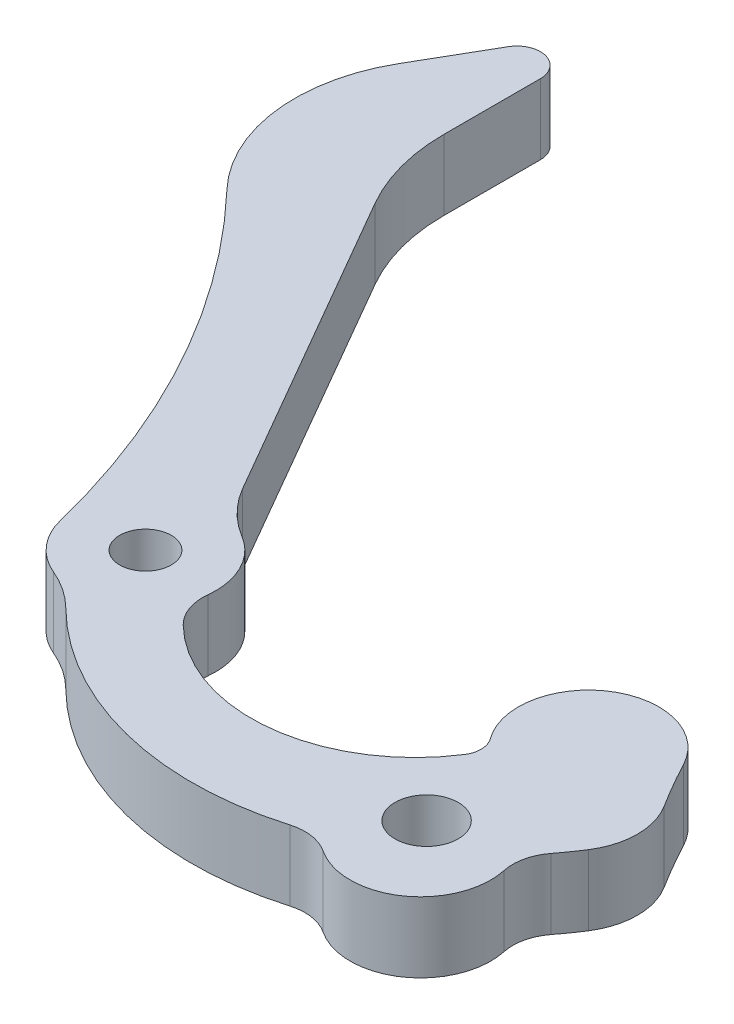
ISO-10303-21;
HEADER;
FILE_DESCRIPTION(('STEP AP214'),'2;1');
FILE_NAME('part.step','',(''),(''),'','','');
FILE_SCHEMA(('AUTOMOTIVE_DESIGN { 1 0 10303 214 1 1 1 1 }'));
ENDSEC;
DATA;
#1=APPLICATION_CONTEXT('core data for automotive mechanical design processes');
#2=APPLICATION_PROTOCOL_DEFINITION('international standard','automotive_design',2000,#1);
#3=PRODUCT_CONTEXT('',#1,'mechanical');
#4=PRODUCT('Part','Part','',(#3));
#5=PRODUCT_RELATED_PRODUCT_CATEGORY('part','',(#4));
#6=PRODUCT_DEFINITION_FORMATION('','',#4);
#7=PRODUCT_DEFINITION_CONTEXT('part definition',#1,'design');
#8=PRODUCT_DEFINITION('design','',#6,#7);
#9=PRODUCT_DEFINITION_SHAPE('','',#8);
#10=(LENGTH_UNIT() NAMED_UNIT(*) SI_UNIT(.MILLI.,.METRE.));
#11=(NAMED_UNIT(*) PLANE_ANGLE_UNIT() SI_UNIT($,.RADIAN.));
#12=(NAMED_UNIT(*) SI_UNIT($,.STERADIAN.) SOLID_ANGLE_UNIT());
#13=UNCERTAINTY_MEASURE_WITH_UNIT(LENGTH_MEASURE(1.E-05),#10,'distance_accuracy_value','');
#14=(GEOMETRIC_REPRESENTATION_CONTEXT(3) GLOBAL_UNCERTAINTY_ASSIGNED_CONTEXT((#13)) GLOBAL_UNIT_ASSIGNED_CONTEXT((#10,
#11,#12)) REPRESENTATION_CONTEXT('',''));
#15=CARTESIAN_POINT('',(0.,0.,0.));
#16=DIRECTION('',(0.,0.,1.));
#17=DIRECTION('',(1.,0.,0.));
#18=AXIS2_PLACEMENT_3D('',#15,#16,#17);
#19=CARTESIAN_POINT('',(9.58333333333333,3.,-5.39997427977414));
#20=DIRECTION('',(0.,-1.,0.));
#21=DIRECTION('',(0.,0.,1.));
#22=AXIS2_PLACEMENT_3D('',#19,#20,#21);
#23=CYLINDRICAL_SURFACE('',#22,13.);
#24=CARTESIAN_POINT('',(9.58333333333333,0.,-5.39997427977414));
#25=DIRECTION('',(0.,-1.,0.));
#26=DIRECTION('',(0.,0.,-1.));
#27=AXIS2_PLACEMENT_3D('',#24,#25,#26);
#28=CIRCLE('',#27,13.);
#29=CARTESIAN_POINT('',(19.8692193431616,0.,2.54990301442477));
#30=VERTEX_POINT('',#29);
#31=CARTESIAN_POINT('',(20.525,0.,1.61999228393224));
#32=VERTEX_POINT('',#31);
#33=EDGE_CURVE('E282',#30,#32,#28,.F.);
#34=ORIENTED_EDGE('',*,*,#33,.T.);
#35=DIRECTION('',(0.,-1.,0.));
#36=VECTOR('',#35,1.);
#37=CARTESIAN_POINT('',(20.525,3.,1.61999228393224));
#38=LINE('',#37,#36);
#39=CARTESIAN_POINT('',(20.525,3.,1.61999228393224));
#40=VERTEX_POINT('',#39);
#41=EDGE_CURVE('E268',#40,#32,#38,.T.);
#42=ORIENTED_EDGE('',*,*,#41,.F.);
#43=CARTESIAN_POINT('',(9.58333333333333,3.,-5.39997427977414));
#44=DIRECTION('',(0.,-1.,0.));
#45=DIRECTION('',(0.,0.,-1.));
#46=AXIS2_PLACEMENT_3D('',#43,#44,#45);
#47=CIRCLE('',#46,13.);
#48=CARTESIAN_POINT('',(19.8692193431616,3.,2.54990301442477));
#49=VERTEX_POINT('',#48);
#50=EDGE_CURVE('E264',#49,#40,#47,.F.);
#51=ORIENTED_EDGE('',*,*,#50,.F.);
#52=DIRECTION('',(0.,-1.,0.));
#53=VECTOR('',#52,1.);
#54=CARTESIAN_POINT('',(19.8692193431616,3.,2.54990301442477));
#55=LINE('',#54,#53);
#56=EDGE_CURVE('E363',#30,#49,#55,.F.);
#57=ORIENTED_EDGE('',*,*,#56,.F.);
#58=EDGE_LOOP('',(#34,#42,#51,#57));
#59=FACE_BOUND('',#58,.T.);
#60=ADVANCED_FACE('F41',(#59),#23,.T.);
#61=CARTESIAN_POINT('',(8.47222222222222,3.,-3.03668414842308));
#62=DIRECTION('',(0.,-1.,0.));
#63=DIRECTION('',(0.,0.,1.));
#64=AXIS2_PLACEMENT_3D('',#61,#62,#63);
#65=CYLINDRICAL_SURFACE('',#64,7.);
#66=CARTESIAN_POINT('',(8.47222222222222,0.,-3.03668414842308));
#67=DIRECTION('',(0.,-1.,0.));
#68=DIRECTION('',(0.,0.,-1.));
#69=AXIS2_PLACEMENT_3D('',#66,#67,#68);
#70=CIRCLE('',#69,7.);
#71=CARTESIAN_POINT('',(3.57117994761107,0.,1.96129390499756));
#72=VERTEX_POINT('',#71);
#73=CARTESIAN_POINT('',(14.3662242350737,0.,0.739655385107008));
#74=VERTEX_POINT('',#73);
#75=EDGE_CURVE('E274',#72,#74,#70,.F.);
#76=ORIENTED_EDGE('',*,*,#75,.F.);
#77=DIRECTION('',(0.,-1.,0.));
#78=VECTOR('',#77,1.);
#79=CARTESIAN_POINT('',(3.57117994761107,3.,1.96129390499756));
#80=LINE('',#79,#78);
#81=CARTESIAN_POINT('',(3.57117994761107,3.,1.96129390499756));
#82=VERTEX_POINT('',#81);
#83=EDGE_CURVE('E296',#82,#72,#80,.T.);
#84=ORIENTED_EDGE('',*,*,#83,.F.);
#85=CARTESIAN_POINT('',(8.47222222222222,3.,-3.03668414842308));
#86=DIRECTION('',(0.,-1.,0.));
#87=DIRECTION('',(0.,0.,-1.));
#88=AXIS2_PLACEMENT_3D('',#85,#86,#87);
#89=CIRCLE('',#88,7.);
#90=CARTESIAN_POINT('',(14.3662242350737,3.,0.739655385107008));
#91=VERTEX_POINT('',#90);
#92=EDGE_CURVE('E256',#82,#91,#89,.F.);
#93=ORIENTED_EDGE('',*,*,#92,.T.);
#94=DIRECTION('',(0.,-1.,0.));
#95=VECTOR('',#94,1.);
#96=CARTESIAN_POINT('',(14.3662242350737,3.,0.739655385107009));
#97=LINE('',#96,#95);
#98=EDGE_CURVE('E299',#74,#91,#97,.F.);
#99=ORIENTED_EDGE('',*,*,#98,.F.);
#100=EDGE_LOOP('',(#76,#84,#93,#99));
#101=FACE_BOUND('',#100,.T.);
#102=ADVANCED_FACE('F409',(#101),#65,.F.);
#103=CARTESIAN_POINT('',(16.75,3.,-2.16506350946109));
#104=DIRECTION('',(0.,-1.,0.));
#105=DIRECTION('',(0.,0.,1.));
#106=AXIS2_PLACEMENT_3D('',#103,#104,#105);
#107=CYLINDRICAL_SURFACE('',#106,3.);
#108=CARTESIAN_POINT('',(16.75,0.,-2.16506350946109));
#109=DIRECTION('',(0.,-1.,0.));
#110=DIRECTION('',(0.,0.,-1.));
#111=AXIS2_PLACEMENT_3D('',#108,#109,#110);
#112=CIRCLE('',#111,3.);
#113=CARTESIAN_POINT('',(14.3306679606426,0.,-0.391132145698955));
#114=VERTEX_POINT('',#113);
#115=CARTESIAN_POINT('',(19.4030298609084,0.,-3.56557504355433));
#116=VERTEX_POINT('',#115);
#117=EDGE_CURVE('E277',#114,#116,#112,.T.);
#118=ORIENTED_EDGE('',*,*,#117,.F.);
#119=DIRECTION('',(0.,-1.,0.));
#120=VECTOR('',#119,1.);
#121=CARTESIAN_POINT('',(14.3306679606426,3.,-0.391132145698955));
#122=LINE('',#121,#120);
#123=CARTESIAN_POINT('',(14.3306679606426,3.,-0.391132145698955));
#124=VERTEX_POINT('',#123);
#125=EDGE_CURVE('E290',#124,#114,#122,.T.);
#126=ORIENTED_EDGE('',*,*,#125,.F.);
#127=CARTESIAN_POINT('',(16.75,3.,-2.16506350946109));
#128=DIRECTION('',(0.,-1.,0.));
#129=DIRECTION('',(0.,0.,-1.));
#130=AXIS2_PLACEMENT_3D('',#127,#128,#129);
#131=CIRCLE('',#130,3.);
#132=CARTESIAN_POINT('',(19.4030298609084,3.,-3.56557504355433));
#133=VERTEX_POINT('',#132);
#134=EDGE_CURVE('E259',#124,#133,#131,.T.);
#135=ORIENTED_EDGE('',*,*,#134,.T.);
#136=DIRECTION('',(0.,-1.,0.));
#137=VECTOR('',#136,1.);
#138=CARTESIAN_POINT('',(19.4030298609084,3.,-3.56557504355433));
#139=LINE('',#138,#137);
#140=EDGE_CURVE('E293',#116,#133,#139,.F.);
#141=ORIENTED_EDGE('',*,*,#140,.F.);
#142=EDGE_LOOP('',(#118,#126,#135,#141));
#143=FACE_BOUND('',#142,.T.);
#144=ADVANCED_FACE('F418',(#143),#107,.T.);
#145=CARTESIAN_POINT('',(18.,3.,0.));
#146=DIRECTION('',(0.,-1.,0.));
#147=DIRECTION('',(0.,0.,1.));
#148=AXIS2_PLACEMENT_3D('',#145,#146,#147);
#149=CYLINDRICAL_SURFACE('',#148,3.);
#150=CARTESIAN_POINT('',(18.,3.,0.));
#151=DIRECTION('',(0.,-1.,0.));
#152=DIRECTION('',(0.,0.,-1.));
#153=AXIS2_PLACEMENT_3D('',#150,#151,#152);
#154=CIRCLE('',#153,3.);
#155=CARTESIAN_POINT('',(20.5393934972721,3.,-1.59733548949879));
#156=VERTEX_POINT('',#155);
#157=EDGE_CURVE('E262',#156,#40,#154,.T.);
#158=ORIENTED_EDGE('',*,*,#157,.T.);
#159=ORIENTED_EDGE('',*,*,#41,.T.);
#160=CARTESIAN_POINT('',(18.,0.,0.));
#161=DIRECTION('',(0.,-1.,0.));
#162=DIRECTION('',(0.,0.,-1.));
#163=AXIS2_PLACEMENT_3D('',#160,#161,#162);
#164=CIRCLE('',#163,3.);
#165=CARTESIAN_POINT('',(20.5393934972721,0.,-1.59733548949879));
#166=VERTEX_POINT('',#165);
#167=EDGE_CURVE('E280',#166,#32,#164,.T.);
#168=ORIENTED_EDGE('',*,*,#167,.F.);
#169=DIRECTION('',(0.,-1.,0.));
#170=VECTOR('',#169,1.);
#171=CARTESIAN_POINT('',(20.5393934972721,3.,-1.59733548949879));
#172=LINE('',#171,#170);
#173=EDGE_CURVE('E287',#156,#166,#172,.T.);
#174=ORIENTED_EDGE('',*,*,#173,.F.);
#175=EDGE_LOOP('',(#158,#159,#168,#174));
#176=FACE_BOUND('',#175,.T.);
#177=ADVANCED_FACE('F426',(#176),#149,.T.);
#178=CARTESIAN_POINT('',(0.,3.,0.));
#179=DIRECTION('',(0.,-1.,0.));
#180=DIRECTION('',(0.,0.,1.));
#181=AXIS2_PLACEMENT_3D('',#178,#179,#180);
#182=CYLINDRICAL_SURFACE('',#181,1.1);
#183=CARTESIAN_POINT('',(0.,3.,0.));
#184=DIRECTION('',(0.,-1.,0.));
#185=DIRECTION('',(0.,0.,-1.));
#186=AXIS2_PLACEMENT_3D('',#183,#184,#185);
#187=CIRCLE('',#186,1.1);
#188=CARTESIAN_POINT('',(0.,3.,-1.1));
#189=VERTEX_POINT('',#188);
#190=EDGE_CURVE('E252',#189,#189,#187,.T.);
#191=ORIENTED_EDGE('',*,*,#190,.F.);
#192=EDGE_LOOP('',(#191));
#193=FACE_BOUND('',#192,.T.);
#194=CARTESIAN_POINT('',(0.,0.,0.));
#195=DIRECTION('',(0.,-1.,0.));
#196=DIRECTION('',(0.,0.,-1.));
#197=AXIS2_PLACEMENT_3D('',#194,#195,#196);
#198=CIRCLE('',#197,1.1);
#199=CARTESIAN_POINT('',(0.,0.,-1.1));
#200=VERTEX_POINT('',#199);
#201=EDGE_CURVE('E271',#200,#200,#198,.T.);
#202=ORIENTED_EDGE('',*,*,#201,.T.);
#203=EDGE_LOOP('',(#202));
#204=FACE_BOUND('',#203,.T.);
#205=ADVANCED_FACE('F473',(#193,#204),#182,.F.);
#206=CARTESIAN_POINT('',(16.,3.,4.));
#207=DIRECTION('',(0.,-1.,0.));
#208=DIRECTION('',(0.,0.,1.));
#209=AXIS2_PLACEMENT_3D('',#206,#207,#208);
#210=CYLINDRICAL_SURFACE('',#209,1.35);
#211=CARTESIAN_POINT('',(16.,3.,4.));
#212=DIRECTION('',(0.,-1.,0.));
#213=DIRECTION('',(0.,0.,-1.));
#214=AXIS2_PLACEMENT_3D('',#211,#212,#213);
#215=CIRCLE('',#214,1.35);
#216=CARTESIAN_POINT('',(16.,3.,2.65));
#217=VERTEX_POINT('',#216);
#218=EDGE_CURVE('E249',#217,#217,#215,.T.);
#219=ORIENTED_EDGE('',*,*,#218,.F.);
#220=EDGE_LOOP('',(#219));
#221=FACE_BOUND('',#220,.T.);
#222=CARTESIAN_POINT('',(16.,0.,4.));
#223=DIRECTION('',(0.,-1.,0.));
#224=DIRECTION('',(0.,0.,-1.));
#225=AXIS2_PLACEMENT_3D('',#222,#223,#224);
#226=CIRCLE('',#225,1.35);
#227=CARTESIAN_POINT('',(16.,0.,2.65));
#228=VERTEX_POINT('',#227);
#229=EDGE_CURVE('E247',#228,#228,#226,.T.);
#230=ORIENTED_EDGE('',*,*,#229,.T.);
#231=EDGE_LOOP('',(#230));
#232=FACE_BOUND('',#231,.T.);
#233=ADVANCED_FACE('F467',(#221,#232),#210,.F.);
#234=CARTESIAN_POINT('',(0.426397690147714,3.,3.82773018160502));
#235=VERTEX_POINT('',#234);
#236=CARTESIAN_POINT('',(13.2400714875913,3.,7.07513157433364));
#237=VERTEX_POINT('',#236);
#238=EDGE_CURVE('E265',#235,#237,#47,.F.);
#239=ORIENTED_EDGE('',*,*,#238,.F.);
#240=DIRECTION('',(0.,-1.,0.));
#241=VECTOR('',#240,1.);
#242=CARTESIAN_POINT('',(0.426397690147712,3.,3.82773018160502));
#243=LINE('',#242,#241);
#244=CARTESIAN_POINT('',(0.426397690147714,0.,3.82773018160502));
#245=VERTEX_POINT('',#244);
#246=EDGE_CURVE('E310',#245,#235,#243,.F.);
#247=ORIENTED_EDGE('',*,*,#246,.F.);
#248=CARTESIAN_POINT('',(13.2400714875913,0.,7.07513157433364));
#249=VERTEX_POINT('',#248);
#250=EDGE_CURVE('E253',#245,#249,#28,.F.);
#251=ORIENTED_EDGE('',*,*,#250,.T.);
#252=DIRECTION('',(0.,-1.,0.));
#253=VECTOR('',#252,1.);
#254=CARTESIAN_POINT('',(13.2400714875913,3.,7.07513157433364));
#255=LINE('',#254,#253);
#256=EDGE_CURVE('E360',#237,#249,#255,.T.);
#257=ORIENTED_EDGE('',*,*,#256,.F.);
#258=EDGE_LOOP('',(#239,#247,#251,#257));
#259=FACE_BOUND('',#258,.T.);
#260=ADVANCED_FACE('F438',(#259),#23,.T.);
#261=CARTESIAN_POINT('',(0.,3.,0.));
#262=DIRECTION('',(0.,1.,0.));
#263=DIRECTION('',(0.,0.,-1.));
#264=AXIS2_PLACEMENT_3D('',#261,#262,#263);
#265=PLANE('',#264);
#266=DIRECTION('',(0.499999999999994,0.,-0.866025403784442));
#267=VECTOR('',#266,1.);
#268=CARTESIAN_POINT('',(-12.5788030628724,3.,-23.3897885329419));
#269=LINE('',#268,#267);
#270=CARTESIAN_POINT('',(-12.5788030628724,3.,-23.3897885329419));
#271=VERTEX_POINT('',#270);
#272=CARTESIAN_POINT('',(-10.8660254037846,3.,-26.356406460551));
#273=VERTEX_POINT('',#272);
#274=EDGE_CURVE('E242',#271,#273,#269,.T.);
#275=ORIENTED_EDGE('',*,*,#274,.F.);
#276=CARTESIAN_POINT('',(-6.51662523638128,3.,-19.889788532942));
#277=DIRECTION('',(0.,-1.,0.));
#278=DIRECTION('',(0.,0.,-1.));
#279=AXIS2_PLACEMENT_3D('',#276,#277,#278);
#280=CIRCLE('',#279,7.);
#281=CARTESIAN_POINT('',(-11.5788177680424,3.,-15.0551006658306));
#282=VERTEX_POINT('',#281);
#283=EDGE_CURVE('E239',#282,#271,#280,.T.);
#284=ORIENTED_EDGE('',*,*,#283,.F.);
#285=CARTESIAN_POINT('',(-36.889780426348,3.,9.11833866972653));
#286=DIRECTION('',(0.,1.,0.));
#287=DIRECTION('',(0.,0.,1.));
#288=AXIS2_PLACEMENT_3D('',#285,#286,#287);
#289=CIRCLE('',#288,35.);
#290=CARTESIAN_POINT('',(-2.91235108629063,3.,0.719868842346832));
#291=VERTEX_POINT('',#290);
#292=EDGE_CURVE('E237',#291,#282,#289,.T.);
#293=ORIENTED_EDGE('',*,*,#292,.F.);
#294=CARTESIAN_POINT('',(0.,3.,0.));
#295=DIRECTION('',(0.,-1.,0.));
#296=DIRECTION('',(0.,0.,-1.));
#297=AXIS2_PLACEMENT_3D('',#294,#295,#296);
#298=CIRCLE('',#297,3.);
#299=CARTESIAN_POINT('',(-1.16081273780792,3.,2.7663177308008));
#300=VERTEX_POINT('',#299);
#301=EDGE_CURVE('E196',#300,#291,#298,.T.);
#302=ORIENTED_EDGE('',*,*,#301,.F.);
#303=CARTESIAN_POINT('',(-3.09550063415445,3.,7.37684728213547));
#304=DIRECTION('',(0.,-1.,0.));
#305=DIRECTION('',(0.,0.,-1.));
#306=AXIS2_PLACEMENT_3D('',#303,#304,#305);
#307=CIRCLE('',#306,5.);
#308=EDGE_CURVE('E333',#235,#300,#307,.F.);
#309=ORIENTED_EDGE('',*,*,#308,.F.);
#310=ORIENTED_EDGE('',*,*,#238,.T.);
#311=CARTESIAN_POINT('',(13.8026465882464,3.,8.99437862881175));
#312=DIRECTION('',(0.,-1.,0.));
#313=DIRECTION('',(0.,0.,-1.));
#314=AXIS2_PLACEMENT_3D('',#311,#312,#313);
#315=CIRCLE('',#314,2.);
#316=CARTESIAN_POINT('',(14.9071048278201,3.,7.32699385107217));
#317=VERTEX_POINT('',#316);
#318=EDGE_CURVE('E365',#317,#237,#315,.F.);
#319=ORIENTED_EDGE('',*,*,#318,.F.);
#320=CARTESIAN_POINT('',(16.5637921871807,3.,4.82591668446279));
#321=DIRECTION('',(0.,-1.,0.));
#322=DIRECTION('',(0.,0.,-1.));
#323=AXIS2_PLACEMENT_3D('',#320,#321,#322);
#324=CIRCLE('',#323,3.);
#325=CARTESIAN_POINT('',(19.4965148816765,3.,4.1941433095968));
#326=VERTEX_POINT('',#325);
#327=EDGE_CURVE('E373',#326,#317,#324,.T.);
#328=ORIENTED_EDGE('',*,*,#327,.F.);
#329=CARTESIAN_POINT('',(21.4516633446736,3.,3.77296105968614));
#330=DIRECTION('',(0.,-1.,0.));
#331=DIRECTION('',(0.,0.,-1.));
#332=AXIS2_PLACEMENT_3D('',#329,#330,#331);
#333=CIRCLE('',#332,2.);
#334=EDGE_CURVE('E49',#49,#326,#333,.F.);
#335=ORIENTED_EDGE('',*,*,#334,.F.);
#336=ORIENTED_EDGE('',*,*,#50,.T.);
#337=ORIENTED_EDGE('',*,*,#157,.F.);
#338=CARTESIAN_POINT('',(45.9333284699927,3.,-17.5706903844867));
#339=DIRECTION('',(0.,-1.,0.));
#340=DIRECTION('',(0.,0.,-1.));
#341=AXIS2_PLACEMENT_3D('',#338,#339,#340);
#342=CIRCLE('',#341,30.);
#343=EDGE_CURVE('E315',#133,#156,#342,.F.);
#344=ORIENTED_EDGE('',*,*,#343,.F.);
#345=ORIENTED_EDGE('',*,*,#134,.F.);
#346=CARTESIAN_POINT('',(13.5242239475235,3.,0.200178308888424));
#347=DIRECTION('',(0.,-1.,0.));
#348=DIRECTION('',(0.,0.,-1.));
#349=AXIS2_PLACEMENT_3D('',#346,#347,#348);
#350=CIRCLE('',#349,1.);
#351=EDGE_CURVE('E319',#91,#124,#350,.F.);
#352=ORIENTED_EDGE('',*,*,#351,.F.);
#353=ORIENTED_EDGE('',*,*,#92,.F.);
#354=CARTESIAN_POINT('',(4.97147774035711,3.,0.533300175448805));
#355=DIRECTION('',(0.,-1.,0.));
#356=DIRECTION('',(0.,0.,-1.));
#357=AXIS2_PLACEMENT_3D('',#354,#355,#356);
#358=CIRCLE('',#357,2.);
#359=CARTESIAN_POINT('',(2.98288664421427,3.,0.319980105269283));
#360=VERTEX_POINT('',#359);
#361=EDGE_CURVE('E324',#360,#82,#358,.F.);
#362=ORIENTED_EDGE('',*,*,#361,.F.);
#363=CARTESIAN_POINT('',(1.54713230752025,3.,-2.57028823734364));
#364=VERTEX_POINT('',#363);
#365=EDGE_CURVE('E236',#364,#360,#298,.T.);
#366=ORIENTED_EDGE('',*,*,#365,.F.);
#367=CARTESIAN_POINT('',(4.12568615338733,3.,-6.8541019662497));
#368=DIRECTION('',(0.,-1.,0.));
#369=DIRECTION('',(0.,0.,-1.));
#370=AXIS2_PLACEMENT_3D('',#367,#368,#369);
#371=CIRCLE('',#370,5.);
#372=CARTESIAN_POINT('',(-0.204440865534852,3.,-4.35410196624969));
#373=VERTEX_POINT('',#372);
#374=EDGE_CURVE('E326',#373,#364,#371,.F.);
#375=ORIENTED_EDGE('',*,*,#374,.F.);
#376=DIRECTION('',(0.500000000000004,0.,0.866025403784436));
#377=VECTOR('',#376,1.);
#378=CARTESIAN_POINT('',(0.614016818818969,3.,-2.93649167310371));
#379=LINE('',#378,#377);
#380=CARTESIAN_POINT('',(-7.9282032302756,3.,-17.7320508075689));
#381=VERTEX_POINT('',#380);
#382=EDGE_CURVE('E231',#381,#373,#379,.T.);
#383=ORIENTED_EDGE('',*,*,#382,.F.);
#384=CARTESIAN_POINT('',(-1.00000000000011,3.,-21.7320508075689));
#385=DIRECTION('',(0.,-1.,0.));
#386=DIRECTION('',(0.,0.,-1.));
#387=AXIS2_PLACEMENT_3D('',#384,#385,#386);
#388=CIRCLE('',#387,8.);
#389=CARTESIAN_POINT('',(-9.00000000000011,3.,-21.7320508075689));
#390=VERTEX_POINT('',#389);
#391=EDGE_CURVE('E350',#390,#381,#388,.F.);
#392=ORIENTED_EDGE('',*,*,#391,.F.);
#393=DIRECTION('',(0.,0.,1.));
#394=VECTOR('',#393,1.);
#395=CARTESIAN_POINT('',(-9.00000000000011,3.,-29.5884572681199));
#396=LINE('',#395,#394);
#397=CARTESIAN_POINT('',(-9.00000000000011,3.,-25.856406460551));
#398=VERTEX_POINT('',#397);
#399=EDGE_CURVE('E228',#398,#390,#396,.T.);
#400=ORIENTED_EDGE('',*,*,#399,.F.);
#401=CARTESIAN_POINT('',(-10.0000000000001,3.,-25.856406460551));
#402=DIRECTION('',(0.,-1.,0.));
#403=DIRECTION('',(0.,0.,-1.));
#404=AXIS2_PLACEMENT_3D('',#401,#402,#403);
#405=CIRCLE('',#404,1.);
#406=EDGE_CURVE('E338',#273,#398,#405,.T.);
#407=ORIENTED_EDGE('',*,*,#406,.F.);
#408=EDGE_LOOP('',(#275,#284,#293,#302,#309,#310,#319,#328,#335,#336,#337,#344,#345,#352,#353,
#362,#366,#375,#383,#392,#400,#407));
#409=FACE_BOUND('',#408,.T.);
#410=ORIENTED_EDGE('',*,*,#218,.T.);
#411=EDGE_LOOP('',(#410));
#412=FACE_BOUND('',#411,.T.);
#413=ORIENTED_EDGE('',*,*,#190,.T.);
#414=EDGE_LOOP('',(#413));
#415=FACE_BOUND('',#414,.T.);
#416=ADVANCED_FACE('F375',(#409,#412,#415),#265,.T.);
#417=CARTESIAN_POINT('',(0.,0.,0.));
#418=DIRECTION('',(0.,1.,0.));
#419=DIRECTION('',(0.,0.,-1.));
#420=AXIS2_PLACEMENT_3D('',#417,#418,#419);
#421=PLANE('',#420);
#422=DIRECTION('',(0.,0.,1.));
#423=VECTOR('',#422,1.);
#424=CARTESIAN_POINT('',(-9.00000000000011,0.,-29.5884572681199));
#425=LINE('',#424,#423);
#426=CARTESIAN_POINT('',(-9.00000000000011,0.,-25.856406460551));
#427=VERTEX_POINT('',#426);
#428=CARTESIAN_POINT('',(-9.00000000000011,0.,-21.7320508075689));
#429=VERTEX_POINT('',#428);
#430=EDGE_CURVE('E221',#427,#429,#425,.T.);
#431=ORIENTED_EDGE('',*,*,#430,.T.);
#432=CARTESIAN_POINT('',(-1.00000000000011,0.,-21.7320508075689));
#433=DIRECTION('',(0.,-1.,0.));
#434=DIRECTION('',(0.,0.,-1.));
#435=AXIS2_PLACEMENT_3D('',#432,#433,#434);
#436=CIRCLE('',#435,8.);
#437=CARTESIAN_POINT('',(-7.9282032302756,0.,-17.7320508075689));
#438=VERTEX_POINT('',#437);
#439=EDGE_CURVE('E353',#438,#429,#436,.T.);
#440=ORIENTED_EDGE('',*,*,#439,.F.);
#441=DIRECTION('',(0.500000000000004,0.,0.866025403784436));
#442=VECTOR('',#441,1.);
#443=CARTESIAN_POINT('',(0.614016818818969,0.,-2.93649167310371));
#444=LINE('',#443,#442);
#445=CARTESIAN_POINT('',(-0.204440865534852,0.,-4.35410196624969));
#446=VERTEX_POINT('',#445);
#447=EDGE_CURVE('E217',#438,#446,#444,.T.);
#448=ORIENTED_EDGE('',*,*,#447,.T.);
#449=CARTESIAN_POINT('',(4.12568615338733,0.,-6.8541019662497));
#450=DIRECTION('',(0.,-1.,0.));
#451=DIRECTION('',(0.,0.,-1.));
#452=AXIS2_PLACEMENT_3D('',#449,#450,#451);
#453=CIRCLE('',#452,5.);
#454=CARTESIAN_POINT('',(1.54713230752025,0.,-2.57028823734364));
#455=VERTEX_POINT('',#454);
#456=EDGE_CURVE('E329',#455,#446,#453,.T.);
#457=ORIENTED_EDGE('',*,*,#456,.F.);
#458=CARTESIAN_POINT('',(0.,0.,0.));
#459=DIRECTION('',(0.,-1.,0.));
#460=DIRECTION('',(0.,0.,-1.));
#461=AXIS2_PLACEMENT_3D('',#458,#459,#460);
#462=CIRCLE('',#461,3.);
#463=CARTESIAN_POINT('',(2.98288664421427,0.,0.319980105269283));
#464=VERTEX_POINT('',#463);
#465=EDGE_CURVE('E210',#455,#464,#462,.T.);
#466=ORIENTED_EDGE('',*,*,#465,.T.);
#467=CARTESIAN_POINT('',(4.97147774035711,0.,0.533300175448805));
#468=DIRECTION('',(0.,-1.,0.));
#469=DIRECTION('',(0.,0.,-1.));
#470=AXIS2_PLACEMENT_3D('',#467,#468,#469);
#471=CIRCLE('',#470,2.);
#472=EDGE_CURVE('E321',#72,#464,#471,.T.);
#473=ORIENTED_EDGE('',*,*,#472,.F.);
#474=ORIENTED_EDGE('',*,*,#75,.T.);
#475=CARTESIAN_POINT('',(13.5242239475235,0.,0.200178308888424));
#476=DIRECTION('',(0.,-1.,0.));
#477=DIRECTION('',(0.,0.,-1.));
#478=AXIS2_PLACEMENT_3D('',#475,#476,#477);
#479=CIRCLE('',#478,1.);
#480=EDGE_CURVE('E317',#114,#74,#479,.T.);
#481=ORIENTED_EDGE('',*,*,#480,.F.);
#482=ORIENTED_EDGE('',*,*,#117,.T.);
#483=CARTESIAN_POINT('',(45.9333284699927,0.,-17.5706903844867));
#484=DIRECTION('',(0.,-1.,0.));
#485=DIRECTION('',(0.,0.,-1.));
#486=AXIS2_PLACEMENT_3D('',#483,#484,#485);
#487=CIRCLE('',#486,30.);
#488=EDGE_CURVE('E313',#166,#116,#487,.T.);
#489=ORIENTED_EDGE('',*,*,#488,.F.);
#490=ORIENTED_EDGE('',*,*,#167,.T.);
#491=ORIENTED_EDGE('',*,*,#33,.F.);
#492=CARTESIAN_POINT('',(21.4516633446736,0.,3.77296105968614));
#493=DIRECTION('',(0.,-1.,0.));
#494=DIRECTION('',(0.,0.,-1.));
#495=AXIS2_PLACEMENT_3D('',#492,#493,#494);
#496=CIRCLE('',#495,2.);
#497=CARTESIAN_POINT('',(19.4965148816765,0.,4.1941433095968));
#498=VERTEX_POINT('',#497);
#499=EDGE_CURVE('E12',#498,#30,#496,.T.);
#500=ORIENTED_EDGE('',*,*,#499,.F.);
#501=CARTESIAN_POINT('',(16.5637921871807,0.,4.82591668446279));
#502=DIRECTION('',(0.,-1.,0.));
#503=DIRECTION('',(0.,0.,-1.));
#504=AXIS2_PLACEMENT_3D('',#501,#502,#503);
#505=CIRCLE('',#504,3.);
#506=CARTESIAN_POINT('',(14.9071048278201,0.,7.32699385107217));
#507=VERTEX_POINT('',#506);
#508=EDGE_CURVE('E232',#507,#498,#505,.F.);
#509=ORIENTED_EDGE('',*,*,#508,.F.);
#510=CARTESIAN_POINT('',(13.8026465882464,0.,8.99437862881175));
#511=DIRECTION('',(0.,-1.,0.));
#512=DIRECTION('',(0.,0.,-1.));
#513=AXIS2_PLACEMENT_3D('',#510,#511,#512);
#514=CIRCLE('',#513,2.);
#515=EDGE_CURVE('E367',#249,#507,#514,.T.);
#516=ORIENTED_EDGE('',*,*,#515,.F.);
#517=ORIENTED_EDGE('',*,*,#250,.F.);
#518=CARTESIAN_POINT('',(-3.09550063415445,0.,7.37684728213547));
#519=DIRECTION('',(0.,-1.,0.));
#520=DIRECTION('',(0.,0.,-1.));
#521=AXIS2_PLACEMENT_3D('',#518,#519,#520);
#522=CIRCLE('',#521,5.);
#523=CARTESIAN_POINT('',(-1.16081273780792,0.,2.7663177308008));
#524=VERTEX_POINT('',#523);
#525=EDGE_CURVE('E216',#524,#245,#522,.T.);
#526=ORIENTED_EDGE('',*,*,#525,.F.);
#527=CARTESIAN_POINT('',(-2.91235108629063,0.,0.719868842346832));
#528=VERTEX_POINT('',#527);
#529=EDGE_CURVE('E193',#524,#528,#462,.T.);
#530=ORIENTED_EDGE('',*,*,#529,.T.);
#531=CARTESIAN_POINT('',(-36.889780426348,0.,9.11833866972653));
#532=DIRECTION('',(0.,1.,0.));
#533=DIRECTION('',(0.,0.,1.));
#534=AXIS2_PLACEMENT_3D('',#531,#532,#533);
#535=CIRCLE('',#534,35.);
#536=CARTESIAN_POINT('',(-11.5788177680424,0.,-15.0551006658306));
#537=VERTEX_POINT('',#536);
#538=EDGE_CURVE('E204',#528,#537,#535,.T.);
#539=ORIENTED_EDGE('',*,*,#538,.T.);
#540=CARTESIAN_POINT('',(-6.51662523638128,0.,-19.889788532942));
#541=DIRECTION('',(0.,-1.,0.));
#542=DIRECTION('',(0.,0.,-1.));
#543=AXIS2_PLACEMENT_3D('',#540,#541,#542);
#544=CIRCLE('',#543,7.);
#545=CARTESIAN_POINT('',(-12.5788030628724,0.,-23.3897885329419));
#546=VERTEX_POINT('',#545);
#547=EDGE_CURVE('E209',#537,#546,#544,.T.);
#548=ORIENTED_EDGE('',*,*,#547,.T.);
#549=DIRECTION('',(0.499999999999994,0.,-0.866025403784442));
#550=VECTOR('',#549,1.);
#551=CARTESIAN_POINT('',(-12.5788030628724,0.,-23.3897885329419));
#552=LINE('',#551,#550);
#553=CARTESIAN_POINT('',(-10.8660254037846,0.,-26.356406460551));
#554=VERTEX_POINT('',#553);
#555=EDGE_CURVE('E201',#546,#554,#552,.T.);
#556=ORIENTED_EDGE('',*,*,#555,.T.);
#557=CARTESIAN_POINT('',(-10.0000000000001,0.,-25.856406460551));
#558=DIRECTION('',(0.,-1.,0.));
#559=DIRECTION('',(0.,0.,-1.));
#560=AXIS2_PLACEMENT_3D('',#557,#558,#559);
#561=CIRCLE('',#560,1.);
#562=EDGE_CURVE('E345',#427,#554,#561,.F.);
#563=ORIENTED_EDGE('',*,*,#562,.F.);
#564=EDGE_LOOP('',(#431,#440,#448,#457,#466,#473,#474,#481,#482,#489,#490,#491,#500,#509,#516,
#517,#526,#530,#539,#548,#556,#563));
#565=FACE_BOUND('',#564,.T.);
#566=ORIENTED_EDGE('',*,*,#229,.F.);
#567=EDGE_LOOP('',(#566));
#568=FACE_BOUND('',#567,.T.);
#569=ORIENTED_EDGE('',*,*,#201,.F.);
#570=EDGE_LOOP('',(#569));
#571=FACE_BOUND('',#570,.T.);
#572=ADVANCED_FACE('F213',(#565,#568,#571),#421,.F.);
#573=CARTESIAN_POINT('',(0.,0.,0.));
#574=DIRECTION('',(0.,1.,0.));
#575=DIRECTION('',(0.,0.,-1.));
#576=AXIS2_PLACEMENT_3D('',#573,#574,#575);
#577=CYLINDRICAL_SURFACE('',#576,3.);
#578=ORIENTED_EDGE('',*,*,#465,.F.);
#579=DIRECTION('',(0.,1.,0.));
#580=VECTOR('',#579,1.);
#581=CARTESIAN_POINT('',(1.54713230752025,0.,-2.57028823734364));
#582=LINE('',#581,#580);
#583=EDGE_CURVE('E302',#364,#455,#582,.F.);
#584=ORIENTED_EDGE('',*,*,#583,.F.);
#585=ORIENTED_EDGE('',*,*,#365,.T.);
#586=DIRECTION('',(0.,1.,0.));
#587=VECTOR('',#586,1.);
#588=CARTESIAN_POINT('',(2.98288664421427,0.,0.319980105269283));
#589=LINE('',#588,#587);
#590=EDGE_CURVE('E304',#464,#360,#589,.T.);
#591=ORIENTED_EDGE('',*,*,#590,.F.);
#592=EDGE_LOOP('',(#578,#584,#585,#591));
#593=FACE_BOUND('',#592,.T.);
#594=ADVANCED_FACE('F401',(#593),#577,.T.);
#595=CARTESIAN_POINT('',(-9.00000000000011,0.,-29.5884572681199));
#596=DIRECTION('',(1.,0.,0.));
#597=DIRECTION('',(0.,0.,1.));
#598=AXIS2_PLACEMENT_3D('',#595,#596,#597);
#599=PLANE('',#598);
#600=ORIENTED_EDGE('',*,*,#399,.T.);
#601=DIRECTION('',(0.,1.,0.));
#602=VECTOR('',#601,1.);
#603=CARTESIAN_POINT('',(-9.00000000000011,3.,-21.7320508075689));
#604=LINE('',#603,#602);
#605=EDGE_CURVE('E341',#429,#390,#604,.T.);
#606=ORIENTED_EDGE('',*,*,#605,.F.);
#607=ORIENTED_EDGE('',*,*,#430,.F.);
#608=DIRECTION('',(0.,1.,0.));
#609=VECTOR('',#608,1.);
#610=CARTESIAN_POINT('',(-9.00000000000011,0.,-25.856406460551));
#611=LINE('',#610,#609);
#612=EDGE_CURVE('E343',#398,#427,#611,.F.);
#613=ORIENTED_EDGE('',*,*,#612,.F.);
#614=EDGE_LOOP('',(#600,#606,#607,#613));
#615=FACE_BOUND('',#614,.T.);
#616=ADVANCED_FACE('F384',(#615),#599,.T.);
#617=CARTESIAN_POINT('',(-12.5788030628724,0.,-23.3897885329419));
#618=DIRECTION('',(-0.866025403784442,0.,-0.499999999999994));
#619=DIRECTION('',(0.499999999999994,0.,-0.866025403784442));
#620=AXIS2_PLACEMENT_3D('',#617,#618,#619);
#621=PLANE('',#620);
#622=ORIENTED_EDGE('',*,*,#555,.F.);
#623=DIRECTION('',(0.,1.,0.));
#624=VECTOR('',#623,1.);
#625=CARTESIAN_POINT('',(-12.5788030628724,0.,-23.3897885329419));
#626=LINE('',#625,#624);
#627=EDGE_CURVE('E245',#546,#271,#626,.T.);
#628=ORIENTED_EDGE('',*,*,#627,.T.);
#629=ORIENTED_EDGE('',*,*,#274,.T.);
#630=DIRECTION('',(0.,1.,0.));
#631=VECTOR('',#630,1.);
#632=CARTESIAN_POINT('',(-10.8660254037846,0.,-26.356406460551));
#633=LINE('',#632,#631);
#634=EDGE_CURVE('E336',#554,#273,#633,.T.);
#635=ORIENTED_EDGE('',*,*,#634,.F.);
#636=EDGE_LOOP('',(#622,#628,#629,#635));
#637=FACE_BOUND('',#636,.T.);
#638=ADVANCED_FACE('F447',(#637),#621,.T.);
#639=CARTESIAN_POINT('',(-6.51662523638128,0.,-19.889788532942));
#640=DIRECTION('',(0.,1.,0.));
#641=DIRECTION('',(0.,0.,-1.));
#642=AXIS2_PLACEMENT_3D('',#639,#640,#641);
#643=CYLINDRICAL_SURFACE('',#642,7.);
#644=ORIENTED_EDGE('',*,*,#283,.T.);
#645=ORIENTED_EDGE('',*,*,#627,.F.);
#646=ORIENTED_EDGE('',*,*,#547,.F.);
#647=DIRECTION('',(0.,1.,0.));
#648=VECTOR('',#647,1.);
#649=CARTESIAN_POINT('',(-11.5788177680424,0.,-15.0551006658306));
#650=LINE('',#649,#648);
#651=EDGE_CURVE('E200',#537,#282,#650,.T.);
#652=ORIENTED_EDGE('',*,*,#651,.T.);
#653=EDGE_LOOP('',(#644,#645,#646,#652));
#654=FACE_BOUND('',#653,.T.);
#655=ADVANCED_FACE('F444',(#654),#643,.T.);
#656=CARTESIAN_POINT('',(-36.889780426348,0.,9.11833866972653));
#657=DIRECTION('',(0.,1.,0.));
#658=DIRECTION('',(0.,0.,-1.));
#659=AXIS2_PLACEMENT_3D('',#656,#657,#658);
#660=CYLINDRICAL_SURFACE('',#659,35.);
#661=ORIENTED_EDGE('',*,*,#292,.T.);
#662=ORIENTED_EDGE('',*,*,#651,.F.);
#663=ORIENTED_EDGE('',*,*,#538,.F.);
#664=DIRECTION('',(0.,1.,0.));
#665=VECTOR('',#664,1.);
#666=CARTESIAN_POINT('',(-2.91235108629063,0.,0.719868842346832));
#667=LINE('',#666,#665);
#668=EDGE_CURVE('E189',#528,#291,#667,.T.);
#669=ORIENTED_EDGE('',*,*,#668,.T.);
#670=EDGE_LOOP('',(#661,#662,#663,#669));
#671=FACE_BOUND('',#670,.T.);
#672=ADVANCED_FACE('F205',(#671),#660,.F.);
#673=ORIENTED_EDGE('',*,*,#301,.T.);
#674=ORIENTED_EDGE('',*,*,#668,.F.);
#675=ORIENTED_EDGE('',*,*,#529,.F.);
#676=DIRECTION('',(0.,1.,0.));
#677=VECTOR('',#676,1.);
#678=CARTESIAN_POINT('',(-1.16081273780792,0.,2.7663177308008));
#679=LINE('',#678,#677);
#680=EDGE_CURVE('E308',#300,#524,#679,.F.);
#681=ORIENTED_EDGE('',*,*,#680,.F.);
#682=EDGE_LOOP('',(#673,#674,#675,#681));
#683=FACE_BOUND('',#682,.T.);
#684=ADVANCED_FACE('F191',(#683),#577,.T.);
#685=CARTESIAN_POINT('',(0.614016818818969,0.,-2.93649167310371));
#686=DIRECTION('',(0.866025403784436,0.,-0.500000000000004));
#687=DIRECTION('',(0.500000000000004,0.,0.866025403784436));
#688=AXIS2_PLACEMENT_3D('',#685,#686,#687);
#689=PLANE('',#688);
#690=ORIENTED_EDGE('',*,*,#382,.T.);
#691=DIRECTION('',(0.,-1.,0.));
#692=VECTOR('',#691,1.);
#693=CARTESIAN_POINT('',(-0.204440865534852,3.,-4.35410196624968));
#694=LINE('',#693,#692);
#695=EDGE_CURVE('E306',#446,#373,#694,.F.);
#696=ORIENTED_EDGE('',*,*,#695,.F.);
#697=ORIENTED_EDGE('',*,*,#447,.F.);
#698=DIRECTION('',(0.,1.,0.));
#699=VECTOR('',#698,1.);
#700=CARTESIAN_POINT('',(-7.9282032302756,0.,-17.7320508075689));
#701=LINE('',#700,#699);
#702=EDGE_CURVE('E348',#381,#438,#701,.F.);
#703=ORIENTED_EDGE('',*,*,#702,.F.);
#704=EDGE_LOOP('',(#690,#696,#697,#703));
#705=FACE_BOUND('',#704,.T.);
#706=ADVANCED_FACE('F392',(#705),#689,.T.);
#707=CARTESIAN_POINT('',(45.9333284699927,3.,-17.5706903844867));
#708=DIRECTION('',(0.,1.,0.));
#709=DIRECTION('',(0.,0.,-1.));
#710=AXIS2_PLACEMENT_3D('',#707,#708,#709);
#711=CYLINDRICAL_SURFACE('',#710,30.);
#712=ORIENTED_EDGE('',*,*,#343,.T.);
#713=ORIENTED_EDGE('',*,*,#173,.T.);
#714=ORIENTED_EDGE('',*,*,#488,.T.);
#715=ORIENTED_EDGE('',*,*,#140,.T.);
#716=EDGE_LOOP('',(#712,#713,#714,#715));
#717=FACE_BOUND('',#716,.T.);
#718=ADVANCED_FACE('F423',(#717),#711,.F.);
#719=CARTESIAN_POINT('',(13.5242239475235,3.,0.200178308888424));
#720=DIRECTION('',(0.,-1.,0.));
#721=DIRECTION('',(0.,0.,1.));
#722=AXIS2_PLACEMENT_3D('',#719,#720,#721);
#723=CYLINDRICAL_SURFACE('',#722,1.);
#724=ORIENTED_EDGE('',*,*,#351,.T.);
#725=ORIENTED_EDGE('',*,*,#125,.T.);
#726=ORIENTED_EDGE('',*,*,#480,.T.);
#727=ORIENTED_EDGE('',*,*,#98,.T.);
#728=EDGE_LOOP('',(#724,#725,#726,#727));
#729=FACE_BOUND('',#728,.T.);
#730=ADVANCED_FACE('F412',(#729),#723,.F.);
#731=CARTESIAN_POINT('',(4.97147774035711,0.,0.533300175448805));
#732=DIRECTION('',(0.,-1.,0.));
#733=DIRECTION('',(0.,0.,1.));
#734=AXIS2_PLACEMENT_3D('',#731,#732,#733);
#735=CYLINDRICAL_SURFACE('',#734,2.);
#736=ORIENTED_EDGE('',*,*,#361,.T.);
#737=ORIENTED_EDGE('',*,*,#83,.T.);
#738=ORIENTED_EDGE('',*,*,#472,.T.);
#739=ORIENTED_EDGE('',*,*,#590,.T.);
#740=EDGE_LOOP('',(#736,#737,#738,#739));
#741=FACE_BOUND('',#740,.T.);
#742=ADVANCED_FACE('F404',(#741),#735,.F.);
#743=CARTESIAN_POINT('',(4.12568615338733,0.,-6.8541019662497));
#744=DIRECTION('',(0.,1.,0.));
#745=DIRECTION('',(0.,0.,-1.));
#746=AXIS2_PLACEMENT_3D('',#743,#744,#745);
#747=CYLINDRICAL_SURFACE('',#746,5.);
#748=ORIENTED_EDGE('',*,*,#456,.T.);
#749=ORIENTED_EDGE('',*,*,#695,.T.);
#750=ORIENTED_EDGE('',*,*,#374,.T.);
#751=ORIENTED_EDGE('',*,*,#583,.T.);
#752=EDGE_LOOP('',(#748,#749,#750,#751));
#753=FACE_BOUND('',#752,.T.);
#754=ADVANCED_FACE('F396',(#753),#747,.F.);
#755=CARTESIAN_POINT('',(-3.09550063415445,3.,7.37684728213547));
#756=DIRECTION('',(0.,1.,0.));
#757=DIRECTION('',(0.,0.,-1.));
#758=AXIS2_PLACEMENT_3D('',#755,#756,#757);
#759=CYLINDRICAL_SURFACE('',#758,5.);
#760=ORIENTED_EDGE('',*,*,#308,.T.);
#761=ORIENTED_EDGE('',*,*,#680,.T.);
#762=ORIENTED_EDGE('',*,*,#525,.T.);
#763=ORIENTED_EDGE('',*,*,#246,.T.);
#764=EDGE_LOOP('',(#760,#761,#762,#763));
#765=FACE_BOUND('',#764,.T.);
#766=ADVANCED_FACE('F440',(#765),#759,.F.);
#767=CARTESIAN_POINT('',(-10.0000000000001,0.,-25.856406460551));
#768=DIRECTION('',(0.,1.,0.));
#769=DIRECTION('',(0.,0.,-1.));
#770=AXIS2_PLACEMENT_3D('',#767,#768,#769);
#771=CYLINDRICAL_SURFACE('',#770,1.);
#772=ORIENTED_EDGE('',*,*,#562,.T.);
#773=ORIENTED_EDGE('',*,*,#634,.T.);
#774=ORIENTED_EDGE('',*,*,#406,.T.);
#775=ORIENTED_EDGE('',*,*,#612,.T.);
#776=EDGE_LOOP('',(#772,#773,#774,#775));
#777=FACE_BOUND('',#776,.T.);
#778=ADVANCED_FACE('F449',(#777),#771,.T.);
#779=CARTESIAN_POINT('',(-1.00000000000011,0.,-21.7320508075689));
#780=DIRECTION('',(0.,-1.,0.));
#781=DIRECTION('',(0.,0.,1.));
#782=AXIS2_PLACEMENT_3D('',#779,#780,#781);
#783=CYLINDRICAL_SURFACE('',#782,8.);
#784=ORIENTED_EDGE('',*,*,#439,.T.);
#785=ORIENTED_EDGE('',*,*,#605,.T.);
#786=ORIENTED_EDGE('',*,*,#391,.T.);
#787=ORIENTED_EDGE('',*,*,#702,.T.);
#788=EDGE_LOOP('',(#784,#785,#786,#787));
#789=FACE_BOUND('',#788,.T.);
#790=ADVANCED_FACE('F388',(#789),#783,.F.);
#791=CARTESIAN_POINT('',(16.5637921871807,-6.93890842292127,4.82591668446279));
#792=DIRECTION('',(0.,1.,0.));
#793=DIRECTION('',(0.,0.,-1.));
#794=AXIS2_PLACEMENT_3D('',#791,#792,#793);
#795=CYLINDRICAL_SURFACE('',#794,3.);
#796=ORIENTED_EDGE('',*,*,#508,.T.);
#797=DIRECTION('',(0.,1.,0.));
#798=VECTOR('',#797,1.);
#799=CARTESIAN_POINT('',(19.4965148816765,-6.93890842292127,4.1941433095968));
#800=LINE('',#799,#798);
#801=EDGE_CURVE('E356',#326,#498,#800,.F.);
#802=ORIENTED_EDGE('',*,*,#801,.F.);
#803=ORIENTED_EDGE('',*,*,#327,.T.);
#804=DIRECTION('',(0.,1.,0.));
#805=VECTOR('',#804,1.);
#806=CARTESIAN_POINT('',(14.9071048278201,-6.93890842292127,7.32699385107217));
#807=LINE('',#806,#805);
#808=EDGE_CURVE('E358',#507,#317,#807,.T.);
#809=ORIENTED_EDGE('',*,*,#808,.F.);
#810=EDGE_LOOP('',(#796,#802,#803,#809));
#811=FACE_BOUND('',#810,.T.);
#812=ADVANCED_FACE('F431',(#811),#795,.T.);
#813=CARTESIAN_POINT('',(13.8026465882464,3.,8.99437862881175));
#814=DIRECTION('',(0.,-1.,0.));
#815=DIRECTION('',(0.,0.,1.));
#816=AXIS2_PLACEMENT_3D('',#813,#814,#815);
#817=CYLINDRICAL_SURFACE('',#816,2.);
#818=ORIENTED_EDGE('',*,*,#515,.T.);
#819=ORIENTED_EDGE('',*,*,#808,.T.);
#820=ORIENTED_EDGE('',*,*,#318,.T.);
#821=ORIENTED_EDGE('',*,*,#256,.T.);
#822=EDGE_LOOP('',(#818,#819,#820,#821));
#823=FACE_BOUND('',#822,.T.);
#824=ADVANCED_FACE('F433',(#823),#817,.F.);
#825=CARTESIAN_POINT('',(21.4516633446736,-6.93890842292127,3.77296105968614));
#826=DIRECTION('',(0.,-1.,0.));
#827=DIRECTION('',(0.,0.,1.));
#828=AXIS2_PLACEMENT_3D('',#825,#826,#827);
#829=CYLINDRICAL_SURFACE('',#828,2.);
#830=ORIENTED_EDGE('',*,*,#499,.T.);
#831=ORIENTED_EDGE('',*,*,#56,.T.);
#832=ORIENTED_EDGE('',*,*,#334,.T.);
#833=ORIENTED_EDGE('',*,*,#801,.T.);
#834=EDGE_LOOP('',(#830,#831,#832,#833));
#835=FACE_BOUND('',#834,.T.);
#836=ADVANCED_FACE('F43',(#835),#829,.F.);
#837=CLOSED_SHELL('',(#60,#102,#144,#177,#205,#233,#260,#416,#572,#594,#616,#638,#655,#672,#684,
#706,#718,#730,#742,#754,#766,#778,#790,#812,#824,#836));
#838=MANIFOLD_SOLID_BREP('B2',#837);
#839=ADVANCED_BREP_SHAPE_REPRESENTATION('',(#18,#838),#14);
#840=SHAPE_DEFINITION_REPRESENTATION(#9,#839);
ENDSEC;
END-ISO-10303-21;
